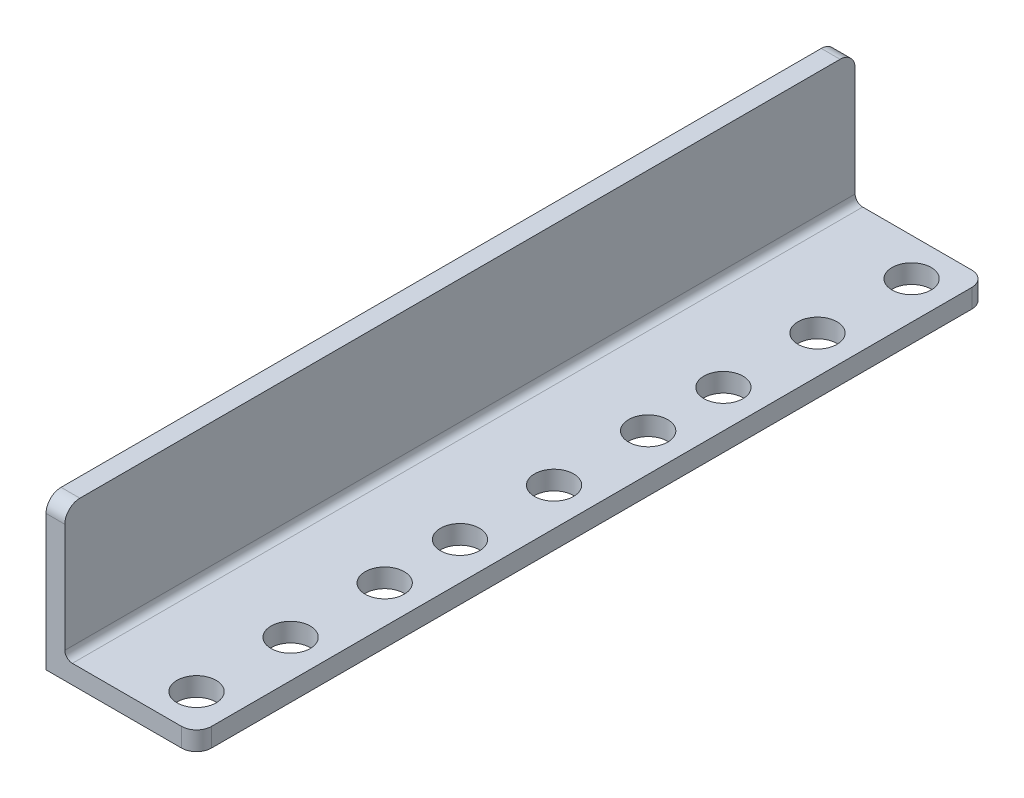
ISO-10303-21;
HEADER;
FILE_DESCRIPTION(('STEP AP214'),'2;1');
FILE_NAME('part.step','',(''),(''),'','','');
FILE_SCHEMA(('AUTOMOTIVE_DESIGN { 1 0 10303 214 1 1 1 1 }'));
ENDSEC;
DATA;
#1=APPLICATION_CONTEXT('core data for automotive mechanical design processes');
#2=APPLICATION_PROTOCOL_DEFINITION('international standard','automotive_design',2000,#1);
#3=PRODUCT_CONTEXT('',#1,'mechanical');
#4=PRODUCT('Part','Part','',(#3));
#5=PRODUCT_RELATED_PRODUCT_CATEGORY('part','',(#4));
#6=PRODUCT_DEFINITION_FORMATION('','',#4);
#7=PRODUCT_DEFINITION_CONTEXT('part definition',#1,'design');
#8=PRODUCT_DEFINITION('design','',#6,#7);
#9=PRODUCT_DEFINITION_SHAPE('','',#8);
#10=(LENGTH_UNIT() NAMED_UNIT(*) SI_UNIT(.MILLI.,.METRE.));
#11=(NAMED_UNIT(*) PLANE_ANGLE_UNIT() SI_UNIT($,.RADIAN.));
#12=(NAMED_UNIT(*) SI_UNIT($,.STERADIAN.) SOLID_ANGLE_UNIT());
#13=UNCERTAINTY_MEASURE_WITH_UNIT(LENGTH_MEASURE(1.E-05),#10,'distance_accuracy_value','');
#14=(GEOMETRIC_REPRESENTATION_CONTEXT(3) GLOBAL_UNCERTAINTY_ASSIGNED_CONTEXT((#13)) GLOBAL_UNIT_ASSIGNED_CONTEXT((#10,
#11,#12)) REPRESENTATION_CONTEXT('',''));
#15=CARTESIAN_POINT('',(0.,0.,0.));
#16=DIRECTION('',(0.,0.,1.));
#17=DIRECTION('',(1.,0.,0.));
#18=AXIS2_PLACEMENT_3D('',#15,#16,#17);
#19=CARTESIAN_POINT('',(19.05,0.,-44.45));
#20=DIRECTION('',(0.,-1.,0.));
#21=DIRECTION('',(0.,0.,-1.));
#22=AXIS2_PLACEMENT_3D('',#19,#20,#21);
#23=CYLINDRICAL_SURFACE('',#22,3.29999999999999);
#24=CARTESIAN_POINT('',(19.05,3.175,-44.45));
#25=DIRECTION('',(0.,-1.,0.));
#26=DIRECTION('',(1.,0.,0.));
#27=AXIS2_PLACEMENT_3D('',#24,#25,#26);
#28=CIRCLE('',#27,3.29999999999999);
#29=CARTESIAN_POINT('',(22.35,3.175,-44.45));
#30=VERTEX_POINT('',#29);
#31=EDGE_CURVE('E190',#30,#30,#28,.T.);
#32=ORIENTED_EDGE('',*,*,#31,.F.);
#33=EDGE_LOOP('',(#32));
#34=FACE_BOUND('',#33,.T.);
#35=CARTESIAN_POINT('',(19.05,0.,-44.45));
#36=DIRECTION('',(0.,-1.,0.));
#37=DIRECTION('',(0.,0.,-1.));
#38=AXIS2_PLACEMENT_3D('',#35,#36,#37);
#39=CIRCLE('',#38,3.29999999999999);
#40=CARTESIAN_POINT('',(19.05,0.,-47.75));
#41=VERTEX_POINT('',#40);
#42=EDGE_CURVE('E193',#41,#41,#39,.T.);
#43=ORIENTED_EDGE('',*,*,#42,.T.);
#44=EDGE_LOOP('',(#43));
#45=FACE_BOUND('',#44,.T.);
#46=ADVANCED_FACE('F35',(#34,#45),#23,.F.);
#47=CARTESIAN_POINT('',(19.05,0.,-60.325));
#48=DIRECTION('',(0.,-1.,0.));
#49=DIRECTION('',(0.,0.,-1.));
#50=AXIS2_PLACEMENT_3D('',#47,#48,#49);
#51=CYLINDRICAL_SURFACE('',#50,3.29999999999999);
#52=CARTESIAN_POINT('',(19.05,3.175,-60.325));
#53=DIRECTION('',(0.,-1.,0.));
#54=DIRECTION('',(1.,0.,0.));
#55=AXIS2_PLACEMENT_3D('',#52,#53,#54);
#56=CIRCLE('',#55,3.29999999999999);
#57=CARTESIAN_POINT('',(22.35,3.175,-60.325));
#58=VERTEX_POINT('',#57);
#59=EDGE_CURVE('E184',#58,#58,#56,.T.);
#60=ORIENTED_EDGE('',*,*,#59,.F.);
#61=EDGE_LOOP('',(#60));
#62=FACE_BOUND('',#61,.T.);
#63=CARTESIAN_POINT('',(19.05,0.,-60.325));
#64=DIRECTION('',(0.,-1.,0.));
#65=DIRECTION('',(0.,0.,-1.));
#66=AXIS2_PLACEMENT_3D('',#63,#64,#65);
#67=CIRCLE('',#66,3.29999999999999);
#68=CARTESIAN_POINT('',(19.05,0.,-63.625));
#69=VERTEX_POINT('',#68);
#70=EDGE_CURVE('E187',#69,#69,#67,.T.);
#71=ORIENTED_EDGE('',*,*,#70,.T.);
#72=EDGE_LOOP('',(#71));
#73=FACE_BOUND('',#72,.T.);
#74=ADVANCED_FACE('F314',(#62,#73),#51,.F.);
#75=CARTESIAN_POINT('',(19.05,0.,-28.575));
#76=DIRECTION('',(0.,-1.,0.));
#77=DIRECTION('',(0.,0.,-1.));
#78=AXIS2_PLACEMENT_3D('',#75,#76,#77);
#79=CYLINDRICAL_SURFACE('',#78,3.29999999999999);
#80=CARTESIAN_POINT('',(19.05,3.175,-28.575));
#81=DIRECTION('',(0.,-1.,0.));
#82=DIRECTION('',(1.,0.,0.));
#83=AXIS2_PLACEMENT_3D('',#80,#81,#82);
#84=CIRCLE('',#83,3.29999999999999);
#85=CARTESIAN_POINT('',(22.35,3.175,-28.575));
#86=VERTEX_POINT('',#85);
#87=EDGE_CURVE('E178',#86,#86,#84,.T.);
#88=ORIENTED_EDGE('',*,*,#87,.F.);
#89=EDGE_LOOP('',(#88));
#90=FACE_BOUND('',#89,.T.);
#91=CARTESIAN_POINT('',(19.05,0.,-28.575));
#92=DIRECTION('',(0.,-1.,0.));
#93=DIRECTION('',(0.,0.,-1.));
#94=AXIS2_PLACEMENT_3D('',#91,#92,#93);
#95=CIRCLE('',#94,3.29999999999999);
#96=CARTESIAN_POINT('',(19.05,0.,-31.875));
#97=VERTEX_POINT('',#96);
#98=EDGE_CURVE('E181',#97,#97,#95,.T.);
#99=ORIENTED_EDGE('',*,*,#98,.T.);
#100=EDGE_LOOP('',(#99));
#101=FACE_BOUND('',#100,.T.);
#102=ADVANCED_FACE('F286',(#90,#101),#79,.F.);
#103=CARTESIAN_POINT('',(25.4,0.,66.675));
#104=DIRECTION('',(0.,1.,0.));
#105=DIRECTION('',(-1.,0.,0.));
#106=AXIS2_PLACEMENT_3D('',#103,#104,#105);
#107=PLANE('',#106);
#108=CARTESIAN_POINT('',(19.05,0.,0.));
#109=DIRECTION('',(0.,-1.,0.));
#110=DIRECTION('',(0.,0.,-1.));
#111=AXIS2_PLACEMENT_3D('',#108,#109,#110);
#112=CIRCLE('',#111,3.29999999999999);
#113=CARTESIAN_POINT('',(19.05,0.,-3.29999999999999));
#114=VERTEX_POINT('',#113);
#115=EDGE_CURVE('E266',#114,#114,#112,.T.);
#116=ORIENTED_EDGE('',*,*,#115,.F.);
#117=EDGE_LOOP('',(#116));
#118=FACE_BOUND('',#117,.T.);
#119=CARTESIAN_POINT('',(19.05,0.,-15.875));
#120=DIRECTION('',(0.,-1.,0.));
#121=DIRECTION('',(0.,0.,-1.));
#122=AXIS2_PLACEMENT_3D('',#119,#120,#121);
#123=CIRCLE('',#122,3.29999999999999);
#124=CARTESIAN_POINT('',(19.05,0.,-19.175));
#125=VERTEX_POINT('',#124);
#126=EDGE_CURVE('E260',#125,#125,#123,.T.);
#127=ORIENTED_EDGE('',*,*,#126,.F.);
#128=EDGE_LOOP('',(#127));
#129=FACE_BOUND('',#128,.T.);
#130=CARTESIAN_POINT('',(19.05,0.,15.875));
#131=DIRECTION('',(0.,-1.,0.));
#132=DIRECTION('',(0.,0.,-1.));
#133=AXIS2_PLACEMENT_3D('',#130,#131,#132);
#134=CIRCLE('',#133,3.29999999999999);
#135=CARTESIAN_POINT('',(19.05,0.,12.575));
#136=VERTEX_POINT('',#135);
#137=EDGE_CURVE('E254',#136,#136,#134,.T.);
#138=ORIENTED_EDGE('',*,*,#137,.F.);
#139=EDGE_LOOP('',(#138));
#140=FACE_BOUND('',#139,.T.);
#141=CARTESIAN_POINT('',(19.05,0.,60.325));
#142=DIRECTION('',(0.,-1.,0.));
#143=DIRECTION('',(0.,0.,-1.));
#144=AXIS2_PLACEMENT_3D('',#141,#142,#143);
#145=CIRCLE('',#144,3.29999999999999);
#146=CARTESIAN_POINT('',(19.05,0.,57.025));
#147=VERTEX_POINT('',#146);
#148=EDGE_CURVE('E251',#147,#147,#145,.T.);
#149=ORIENTED_EDGE('',*,*,#148,.F.);
#150=EDGE_LOOP('',(#149));
#151=FACE_BOUND('',#150,.T.);
#152=CARTESIAN_POINT('',(19.05,0.,44.45));
#153=DIRECTION('',(0.,-1.,0.));
#154=DIRECTION('',(0.,0.,-1.));
#155=AXIS2_PLACEMENT_3D('',#152,#153,#154);
#156=CIRCLE('',#155,3.29999999999999);
#157=CARTESIAN_POINT('',(19.05,0.,41.15));
#158=VERTEX_POINT('',#157);
#159=EDGE_CURVE('E245',#158,#158,#156,.T.);
#160=ORIENTED_EDGE('',*,*,#159,.F.);
#161=EDGE_LOOP('',(#160));
#162=FACE_BOUND('',#161,.T.);
#163=DIRECTION('',(1.,0.,0.));
#164=VECTOR('',#163,1.);
#165=CARTESIAN_POINT('',(25.4,0.,-66.675));
#166=LINE('',#165,#164);
#167=CARTESIAN_POINT('',(0.,0.,-66.675));
#168=VERTEX_POINT('',#167);
#169=CARTESIAN_POINT('',(22.86,0.,-66.675));
#170=VERTEX_POINT('',#169);
#171=EDGE_CURVE('E153',#168,#170,#166,.T.);
#172=ORIENTED_EDGE('',*,*,#171,.T.);
#173=CARTESIAN_POINT('',(22.86,0.,-64.135));
#174=DIRECTION('',(0.,1.,0.));
#175=DIRECTION('',(-1.,0.,0.));
#176=AXIS2_PLACEMENT_3D('',#173,#174,#175);
#177=CIRCLE('',#176,2.54);
#178=CARTESIAN_POINT('',(25.4,0.,-64.135));
#179=VERTEX_POINT('',#178);
#180=EDGE_CURVE('E211',#170,#179,#177,.F.);
#181=ORIENTED_EDGE('',*,*,#180,.T.);
#182=DIRECTION('',(0.,0.,-1.));
#183=VECTOR('',#182,1.);
#184=CARTESIAN_POINT('',(25.4,0.,66.675));
#185=LINE('',#184,#183);
#186=CARTESIAN_POINT('',(25.4,0.,64.135));
#187=VERTEX_POINT('',#186);
#188=EDGE_CURVE('E175',#187,#179,#185,.T.);
#189=ORIENTED_EDGE('',*,*,#188,.F.);
#190=CARTESIAN_POINT('',(22.86,0.,64.135));
#191=DIRECTION('',(0.,1.,0.));
#192=DIRECTION('',(-1.,0.,0.));
#193=AXIS2_PLACEMENT_3D('',#190,#191,#192);
#194=CIRCLE('',#193,2.54);
#195=CARTESIAN_POINT('',(22.86,0.,66.675));
#196=VERTEX_POINT('',#195);
#197=EDGE_CURVE('E209',#187,#196,#194,.F.);
#198=ORIENTED_EDGE('',*,*,#197,.T.);
#199=DIRECTION('',(1.,0.,0.));
#200=VECTOR('',#199,1.);
#201=CARTESIAN_POINT('',(25.4,0.,66.675));
#202=LINE('',#201,#200);
#203=CARTESIAN_POINT('',(0.,0.,66.675));
#204=VERTEX_POINT('',#203);
#205=EDGE_CURVE('E129',#204,#196,#202,.T.);
#206=ORIENTED_EDGE('',*,*,#205,.F.);
#207=DIRECTION('',(0.,0.,-1.));
#208=VECTOR('',#207,1.);
#209=CARTESIAN_POINT('',(0.,0.,66.675));
#210=LINE('',#209,#208);
#211=EDGE_CURVE('E152',#204,#168,#210,.T.);
#212=ORIENTED_EDGE('',*,*,#211,.T.);
#213=EDGE_LOOP('',(#172,#181,#189,#198,#206,#212));
#214=FACE_BOUND('',#213,.T.);
#215=CARTESIAN_POINT('',(19.05,0.,28.575));
#216=DIRECTION('',(0.,-1.,0.));
#217=DIRECTION('',(0.,0.,-1.));
#218=AXIS2_PLACEMENT_3D('',#215,#216,#217);
#219=CIRCLE('',#218,3.29999999999999);
#220=CARTESIAN_POINT('',(19.05,0.,25.275));
#221=VERTEX_POINT('',#220);
#222=EDGE_CURVE('E239',#221,#221,#219,.T.);
#223=ORIENTED_EDGE('',*,*,#222,.F.);
#224=EDGE_LOOP('',(#223));
#225=FACE_BOUND('',#224,.T.);
#226=ORIENTED_EDGE('',*,*,#98,.F.);
#227=EDGE_LOOP('',(#226));
#228=FACE_BOUND('',#227,.T.);
#229=ORIENTED_EDGE('',*,*,#70,.F.);
#230=EDGE_LOOP('',(#229));
#231=FACE_BOUND('',#230,.T.);
#232=ORIENTED_EDGE('',*,*,#42,.F.);
#233=EDGE_LOOP('',(#232));
#234=FACE_BOUND('',#233,.T.);
#235=ADVANCED_FACE('F232',(#118,#129,#140,#151,#162,#214,#225,#228,#231,#234),#107,.F.);
#236=CARTESIAN_POINT('',(25.4,3.175,66.675));
#237=DIRECTION('',(-1.,0.,0.));
#238=DIRECTION('',(0.,0.,1.));
#239=AXIS2_PLACEMENT_3D('',#236,#237,#238);
#240=PLANE('',#239);
#241=ORIENTED_EDGE('',*,*,#188,.T.);
#242=DIRECTION('',(0.,1.,0.));
#243=VECTOR('',#242,1.);
#244=CARTESIAN_POINT('',(25.4,3.175,-64.135));
#245=LINE('',#244,#243);
#246=CARTESIAN_POINT('',(25.4,3.175,-64.135));
#247=VERTEX_POINT('',#246);
#248=EDGE_CURVE('E198',#179,#247,#245,.T.);
#249=ORIENTED_EDGE('',*,*,#248,.T.);
#250=DIRECTION('',(0.,0.,-1.));
#251=VECTOR('',#250,1.);
#252=CARTESIAN_POINT('',(25.4,3.175,66.675));
#253=LINE('',#252,#251);
#254=CARTESIAN_POINT('',(25.4,3.175,64.135));
#255=VERTEX_POINT('',#254);
#256=EDGE_CURVE('E140',#255,#247,#253,.T.);
#257=ORIENTED_EDGE('',*,*,#256,.F.);
#258=DIRECTION('',(0.,1.,0.));
#259=VECTOR('',#258,1.);
#260=CARTESIAN_POINT('',(25.4,3.175,64.135));
#261=LINE('',#260,#259);
#262=EDGE_CURVE('E196',#255,#187,#261,.F.);
#263=ORIENTED_EDGE('',*,*,#262,.T.);
#264=EDGE_LOOP('',(#241,#249,#257,#263));
#265=FACE_BOUND('',#264,.T.);
#266=ADVANCED_FACE('F285',(#265),#240,.F.);
#267=CARTESIAN_POINT('',(4.44500000000001,3.175,66.675));
#268=DIRECTION('',(0.,-1.,0.));
#269=DIRECTION('',(1.,0.,0.));
#270=AXIS2_PLACEMENT_3D('',#267,#268,#269);
#271=PLANE('',#270);
#272=CARTESIAN_POINT('',(19.05,3.175,0.));
#273=DIRECTION('',(0.,-1.,0.));
#274=DIRECTION('',(1.,0.,0.));
#275=AXIS2_PLACEMENT_3D('',#272,#273,#274);
#276=CIRCLE('',#275,3.29999999999999);
#277=CARTESIAN_POINT('',(22.35,3.175,0.));
#278=VERTEX_POINT('',#277);
#279=EDGE_CURVE('E269',#278,#278,#276,.T.);
#280=ORIENTED_EDGE('',*,*,#279,.T.);
#281=EDGE_LOOP('',(#280));
#282=FACE_BOUND('',#281,.T.);
#283=CARTESIAN_POINT('',(19.05,3.175,-15.875));
#284=DIRECTION('',(0.,-1.,0.));
#285=DIRECTION('',(1.,0.,0.));
#286=AXIS2_PLACEMENT_3D('',#283,#284,#285);
#287=CIRCLE('',#286,3.29999999999999);
#288=CARTESIAN_POINT('',(22.35,3.175,-15.875));
#289=VERTEX_POINT('',#288);
#290=EDGE_CURVE('E263',#289,#289,#287,.T.);
#291=ORIENTED_EDGE('',*,*,#290,.T.);
#292=EDGE_LOOP('',(#291));
#293=FACE_BOUND('',#292,.T.);
#294=CARTESIAN_POINT('',(19.05,3.175,15.875));
#295=DIRECTION('',(0.,-1.,0.));
#296=DIRECTION('',(1.,0.,0.));
#297=AXIS2_PLACEMENT_3D('',#294,#295,#296);
#298=CIRCLE('',#297,3.29999999999999);
#299=CARTESIAN_POINT('',(22.35,3.175,15.875));
#300=VERTEX_POINT('',#299);
#301=EDGE_CURVE('E257',#300,#300,#298,.T.);
#302=ORIENTED_EDGE('',*,*,#301,.T.);
#303=EDGE_LOOP('',(#302));
#304=FACE_BOUND('',#303,.T.);
#305=CARTESIAN_POINT('',(19.05,3.175,60.325));
#306=DIRECTION('',(0.,-1.,0.));
#307=DIRECTION('',(1.,0.,0.));
#308=AXIS2_PLACEMENT_3D('',#305,#306,#307);
#309=CIRCLE('',#308,3.29999999999999);
#310=CARTESIAN_POINT('',(22.35,3.175,60.325));
#311=VERTEX_POINT('',#310);
#312=EDGE_CURVE('E248',#311,#311,#309,.T.);
#313=ORIENTED_EDGE('',*,*,#312,.T.);
#314=EDGE_LOOP('',(#313));
#315=FACE_BOUND('',#314,.T.);
#316=CARTESIAN_POINT('',(19.05,3.175,44.45));
#317=DIRECTION('',(0.,-1.,0.));
#318=DIRECTION('',(1.,0.,0.));
#319=AXIS2_PLACEMENT_3D('',#316,#317,#318);
#320=CIRCLE('',#319,3.29999999999999);
#321=CARTESIAN_POINT('',(22.35,3.175,44.45));
#322=VERTEX_POINT('',#321);
#323=EDGE_CURVE('E242',#322,#322,#320,.T.);
#324=ORIENTED_EDGE('',*,*,#323,.T.);
#325=EDGE_LOOP('',(#324));
#326=FACE_BOUND('',#325,.T.);
#327=CARTESIAN_POINT('',(19.05,3.175,28.575));
#328=DIRECTION('',(0.,-1.,0.));
#329=DIRECTION('',(1.,0.,0.));
#330=AXIS2_PLACEMENT_3D('',#327,#328,#329);
#331=CIRCLE('',#330,3.29999999999999);
#332=CARTESIAN_POINT('',(22.35,3.175,28.575));
#333=VERTEX_POINT('',#332);
#334=EDGE_CURVE('E156',#333,#333,#331,.T.);
#335=ORIENTED_EDGE('',*,*,#334,.T.);
#336=EDGE_LOOP('',(#335));
#337=FACE_BOUND('',#336,.T.);
#338=ORIENTED_EDGE('',*,*,#256,.T.);
#339=CARTESIAN_POINT('',(22.86,3.175,-64.135));
#340=DIRECTION('',(0.,-1.,0.));
#341=DIRECTION('',(1.,0.,0.));
#342=AXIS2_PLACEMENT_3D('',#339,#340,#341);
#343=CIRCLE('',#342,2.54);
#344=CARTESIAN_POINT('',(22.86,3.175,-66.675));
#345=VERTEX_POINT('',#344);
#346=EDGE_CURVE('E203',#247,#345,#343,.F.);
#347=ORIENTED_EDGE('',*,*,#346,.T.);
#348=DIRECTION('',(-1.,0.,0.));
#349=VECTOR('',#348,1.);
#350=CARTESIAN_POINT('',(4.44500000000001,3.175,-66.675));
#351=LINE('',#350,#349);
#352=CARTESIAN_POINT('',(4.44500000000001,3.175,-66.675));
#353=VERTEX_POINT('',#352);
#354=EDGE_CURVE('E137',#345,#353,#351,.T.);
#355=ORIENTED_EDGE('',*,*,#354,.T.);
#356=DIRECTION('',(0.,0.,-1.));
#357=VECTOR('',#356,1.);
#358=CARTESIAN_POINT('',(4.44500000000001,3.175,66.675));
#359=LINE('',#358,#357);
#360=CARTESIAN_POINT('',(4.44500000000001,3.175,66.675));
#361=VERTEX_POINT('',#360);
#362=EDGE_CURVE('E132',#361,#353,#359,.T.);
#363=ORIENTED_EDGE('',*,*,#362,.F.);
#364=DIRECTION('',(-1.,0.,0.));
#365=VECTOR('',#364,1.);
#366=CARTESIAN_POINT('',(4.44500000000001,3.175,66.675));
#367=LINE('',#366,#365);
#368=CARTESIAN_POINT('',(22.86,3.175,66.675));
#369=VERTEX_POINT('',#368);
#370=EDGE_CURVE('E120',#369,#361,#367,.T.);
#371=ORIENTED_EDGE('',*,*,#370,.F.);
#372=CARTESIAN_POINT('',(22.86,3.175,64.135));
#373=DIRECTION('',(0.,-1.,0.));
#374=DIRECTION('',(1.,0.,0.));
#375=AXIS2_PLACEMENT_3D('',#372,#373,#374);
#376=CIRCLE('',#375,2.54);
#377=EDGE_CURVE('E201',#369,#255,#376,.F.);
#378=ORIENTED_EDGE('',*,*,#377,.T.);
#379=EDGE_LOOP('',(#338,#347,#355,#363,#371,#378));
#380=FACE_BOUND('',#379,.T.);
#381=ORIENTED_EDGE('',*,*,#87,.T.);
#382=EDGE_LOOP('',(#381));
#383=FACE_BOUND('',#382,.T.);
#384=ORIENTED_EDGE('',*,*,#59,.T.);
#385=EDGE_LOOP('',(#384));
#386=FACE_BOUND('',#385,.T.);
#387=ORIENTED_EDGE('',*,*,#31,.T.);
#388=EDGE_LOOP('',(#387));
#389=FACE_BOUND('',#388,.T.);
#390=ADVANCED_FACE('F134',(#282,#293,#304,#315,#326,#337,#380,#383,#386,#389),#271,.F.);
#391=CARTESIAN_POINT('',(4.445,4.445,66.675));
#392=DIRECTION('',(0.,0.,-1.));
#393=DIRECTION('',(-1.,0.,0.));
#394=AXIS2_PLACEMENT_3D('',#391,#392,#393);
#395=CYLINDRICAL_SURFACE('',#394,1.27);
#396=CARTESIAN_POINT('',(4.445,4.445,-66.675));
#397=DIRECTION('',(0.,0.,-1.));
#398=DIRECTION('',(-1.,0.,0.));
#399=AXIS2_PLACEMENT_3D('',#396,#397,#398);
#400=CIRCLE('',#399,1.27);
#401=CARTESIAN_POINT('',(3.175,4.44500000000001,-66.675));
#402=VERTEX_POINT('',#401);
#403=EDGE_CURVE('E158',#353,#402,#400,.T.);
#404=ORIENTED_EDGE('',*,*,#403,.T.);
#405=DIRECTION('',(0.,0.,-1.));
#406=VECTOR('',#405,1.);
#407=CARTESIAN_POINT('',(3.175,4.44500000000001,66.675));
#408=LINE('',#407,#406);
#409=CARTESIAN_POINT('',(3.175,4.44500000000001,66.675));
#410=VERTEX_POINT('',#409);
#411=EDGE_CURVE('E141',#410,#402,#408,.T.);
#412=ORIENTED_EDGE('',*,*,#411,.F.);
#413=CARTESIAN_POINT('',(4.445,4.445,66.675));
#414=DIRECTION('',(0.,0.,-1.));
#415=DIRECTION('',(-1.,0.,0.));
#416=AXIS2_PLACEMENT_3D('',#413,#414,#415);
#417=CIRCLE('',#416,1.27);
#418=EDGE_CURVE('E125',#361,#410,#417,.T.);
#419=ORIENTED_EDGE('',*,*,#418,.F.);
#420=ORIENTED_EDGE('',*,*,#362,.T.);
#421=EDGE_LOOP('',(#404,#412,#419,#420));
#422=FACE_BOUND('',#421,.T.);
#423=ADVANCED_FACE('F143',(#422),#395,.F.);
#424=CARTESIAN_POINT('',(3.175,25.4,66.675));
#425=DIRECTION('',(-1.,0.,0.));
#426=DIRECTION('',(0.,-1.,0.));
#427=AXIS2_PLACEMENT_3D('',#424,#425,#426);
#428=PLANE('',#427);
#429=DIRECTION('',(0.,1.,0.));
#430=VECTOR('',#429,1.);
#431=CARTESIAN_POINT('',(3.175,25.4,-66.675));
#432=LINE('',#431,#430);
#433=CARTESIAN_POINT('',(3.175,22.86,-66.675));
#434=VERTEX_POINT('',#433);
#435=EDGE_CURVE('E160',#402,#434,#432,.T.);
#436=ORIENTED_EDGE('',*,*,#435,.T.);
#437=CARTESIAN_POINT('',(3.175,22.86,-64.135));
#438=DIRECTION('',(-1.,0.,0.));
#439=DIRECTION('',(0.,-1.,0.));
#440=AXIS2_PLACEMENT_3D('',#437,#438,#439);
#441=CIRCLE('',#440,2.54);
#442=CARTESIAN_POINT('',(3.175,25.4,-64.135));
#443=VERTEX_POINT('',#442);
#444=EDGE_CURVE('E222',#434,#443,#441,.F.);
#445=ORIENTED_EDGE('',*,*,#444,.T.);
#446=DIRECTION('',(0.,0.,-1.));
#447=VECTOR('',#446,1.);
#448=CARTESIAN_POINT('',(3.175,25.4,66.675));
#449=LINE('',#448,#447);
#450=CARTESIAN_POINT('',(3.175,25.4,64.135));
#451=VERTEX_POINT('',#450);
#452=EDGE_CURVE('E170',#451,#443,#449,.T.);
#453=ORIENTED_EDGE('',*,*,#452,.F.);
#454=CARTESIAN_POINT('',(3.175,22.86,64.135));
#455=DIRECTION('',(-1.,0.,0.));
#456=DIRECTION('',(0.,-1.,0.));
#457=AXIS2_PLACEMENT_3D('',#454,#455,#456);
#458=CIRCLE('',#457,2.54);
#459=CARTESIAN_POINT('',(3.175,22.86,66.675));
#460=VERTEX_POINT('',#459);
#461=EDGE_CURVE('E50',#451,#460,#458,.F.);
#462=ORIENTED_EDGE('',*,*,#461,.T.);
#463=DIRECTION('',(0.,1.,0.));
#464=VECTOR('',#463,1.);
#465=CARTESIAN_POINT('',(3.175,25.4,66.675));
#466=LINE('',#465,#464);
#467=EDGE_CURVE('E145',#410,#460,#466,.T.);
#468=ORIENTED_EDGE('',*,*,#467,.F.);
#469=ORIENTED_EDGE('',*,*,#411,.T.);
#470=EDGE_LOOP('',(#436,#445,#453,#462,#468,#469));
#471=FACE_BOUND('',#470,.T.);
#472=ADVANCED_FACE('F346',(#471),#428,.F.);
#473=CARTESIAN_POINT('',(0.,25.4,66.675));
#474=DIRECTION('',(0.,-1.,0.));
#475=DIRECTION('',(0.,0.,-1.));
#476=AXIS2_PLACEMENT_3D('',#473,#474,#475);
#477=PLANE('',#476);
#478=ORIENTED_EDGE('',*,*,#452,.T.);
#479=DIRECTION('',(-1.,0.,0.));
#480=VECTOR('',#479,1.);
#481=CARTESIAN_POINT('',(0.,25.4,-64.135));
#482=LINE('',#481,#480);
#483=CARTESIAN_POINT('',(0.,25.4,-64.135));
#484=VERTEX_POINT('',#483);
#485=EDGE_CURVE('E215',#443,#484,#482,.T.);
#486=ORIENTED_EDGE('',*,*,#485,.T.);
#487=DIRECTION('',(0.,0.,-1.));
#488=VECTOR('',#487,1.);
#489=CARTESIAN_POINT('',(0.,25.4,66.675));
#490=LINE('',#489,#488);
#491=CARTESIAN_POINT('',(0.,25.4,64.135));
#492=VERTEX_POINT('',#491);
#493=EDGE_CURVE('E167',#492,#484,#490,.T.);
#494=ORIENTED_EDGE('',*,*,#493,.F.);
#495=DIRECTION('',(-1.,0.,0.));
#496=VECTOR('',#495,1.);
#497=CARTESIAN_POINT('',(0.,25.4,64.135));
#498=LINE('',#497,#496);
#499=EDGE_CURVE('E213',#492,#451,#498,.F.);
#500=ORIENTED_EDGE('',*,*,#499,.T.);
#501=EDGE_LOOP('',(#478,#486,#494,#500));
#502=FACE_BOUND('',#501,.T.);
#503=ADVANCED_FACE('F351',(#502),#477,.F.);
#504=CARTESIAN_POINT('',(0.,0.,66.675));
#505=DIRECTION('',(1.,0.,0.));
#506=DIRECTION('',(0.,0.,-1.));
#507=AXIS2_PLACEMENT_3D('',#504,#505,#506);
#508=PLANE('',#507);
#509=ORIENTED_EDGE('',*,*,#493,.T.);
#510=CARTESIAN_POINT('',(0.,22.86,-64.135));
#511=DIRECTION('',(1.,0.,0.));
#512=DIRECTION('',(0.,0.,-1.));
#513=AXIS2_PLACEMENT_3D('',#510,#511,#512);
#514=CIRCLE('',#513,2.54);
#515=CARTESIAN_POINT('',(0.,22.86,-66.675));
#516=VERTEX_POINT('',#515);
#517=EDGE_CURVE('E219',#484,#516,#514,.F.);
#518=ORIENTED_EDGE('',*,*,#517,.T.);
#519=DIRECTION('',(0.,-1.,0.));
#520=VECTOR('',#519,1.);
#521=CARTESIAN_POINT('',(0.,0.,-66.675));
#522=LINE('',#521,#520);
#523=EDGE_CURVE('E163',#516,#168,#522,.T.);
#524=ORIENTED_EDGE('',*,*,#523,.T.);
#525=ORIENTED_EDGE('',*,*,#211,.F.);
#526=DIRECTION('',(0.,-1.,0.));
#527=VECTOR('',#526,1.);
#528=CARTESIAN_POINT('',(0.,0.,66.675));
#529=LINE('',#528,#527);
#530=CARTESIAN_POINT('',(0.,22.86,66.675));
#531=VERTEX_POINT('',#530);
#532=EDGE_CURVE('E147',#531,#204,#529,.T.);
#533=ORIENTED_EDGE('',*,*,#532,.F.);
#534=CARTESIAN_POINT('',(0.,22.86,64.135));
#535=DIRECTION('',(1.,0.,0.));
#536=DIRECTION('',(0.,0.,-1.));
#537=AXIS2_PLACEMENT_3D('',#534,#535,#536);
#538=CIRCLE('',#537,2.54);
#539=EDGE_CURVE('E58',#531,#492,#538,.F.);
#540=ORIENTED_EDGE('',*,*,#539,.T.);
#541=EDGE_LOOP('',(#509,#518,#524,#525,#533,#540));
#542=FACE_BOUND('',#541,.T.);
#543=ADVANCED_FACE('F226',(#542),#508,.F.);
#544=CARTESIAN_POINT('',(4.445,4.445,66.675));
#545=DIRECTION('',(0.,0.,-1.));
#546=DIRECTION('',(-1.,0.,0.));
#547=AXIS2_PLACEMENT_3D('',#544,#545,#546);
#548=PLANE('',#547);
#549=ORIENTED_EDGE('',*,*,#205,.T.);
#550=DIRECTION('',(0.,1.,0.));
#551=VECTOR('',#550,1.);
#552=CARTESIAN_POINT('',(22.86,4.445,66.675));
#553=LINE('',#552,#551);
#554=EDGE_CURVE('E11',#196,#369,#553,.T.);
#555=ORIENTED_EDGE('',*,*,#554,.T.);
#556=ORIENTED_EDGE('',*,*,#370,.T.);
#557=ORIENTED_EDGE('',*,*,#418,.T.);
#558=ORIENTED_EDGE('',*,*,#467,.T.);
#559=DIRECTION('',(-1.,0.,0.));
#560=VECTOR('',#559,1.);
#561=CARTESIAN_POINT('',(4.445,22.86,66.675));
#562=LINE('',#561,#560);
#563=EDGE_CURVE('E43',#460,#531,#562,.T.);
#564=ORIENTED_EDGE('',*,*,#563,.T.);
#565=ORIENTED_EDGE('',*,*,#532,.T.);
#566=EDGE_LOOP('',(#549,#555,#556,#557,#558,#564,#565));
#567=FACE_BOUND('',#566,.T.);
#568=ADVANCED_FACE('F123',(#567),#548,.F.);
#569=CARTESIAN_POINT('',(4.445,4.445,-66.675));
#570=DIRECTION('',(0.,0.,-1.));
#571=DIRECTION('',(-1.,0.,0.));
#572=AXIS2_PLACEMENT_3D('',#569,#570,#571);
#573=PLANE('',#572);
#574=ORIENTED_EDGE('',*,*,#354,.F.);
#575=DIRECTION('',(0.,1.,0.));
#576=VECTOR('',#575,1.);
#577=CARTESIAN_POINT('',(22.86,0.,-66.675));
#578=LINE('',#577,#576);
#579=EDGE_CURVE('E207',#345,#170,#578,.F.);
#580=ORIENTED_EDGE('',*,*,#579,.T.);
#581=ORIENTED_EDGE('',*,*,#171,.F.);
#582=ORIENTED_EDGE('',*,*,#523,.F.);
#583=DIRECTION('',(-1.,0.,0.));
#584=VECTOR('',#583,1.);
#585=CARTESIAN_POINT('',(3.175,22.86,-66.675));
#586=LINE('',#585,#584);
#587=EDGE_CURVE('E205',#516,#434,#586,.F.);
#588=ORIENTED_EDGE('',*,*,#587,.T.);
#589=ORIENTED_EDGE('',*,*,#435,.F.);
#590=ORIENTED_EDGE('',*,*,#403,.F.);
#591=EDGE_LOOP('',(#574,#580,#581,#582,#588,#589,#590));
#592=FACE_BOUND('',#591,.T.);
#593=ADVANCED_FACE('F309',(#592),#573,.T.);
#594=CARTESIAN_POINT('',(19.05,0.,28.575));
#595=DIRECTION('',(0.,-1.,0.));
#596=DIRECTION('',(0.,0.,-1.));
#597=AXIS2_PLACEMENT_3D('',#594,#595,#596);
#598=CYLINDRICAL_SURFACE('',#597,3.29999999999999);
#599=ORIENTED_EDGE('',*,*,#334,.F.);
#600=EDGE_LOOP('',(#599));
#601=FACE_BOUND('',#600,.T.);
#602=ORIENTED_EDGE('',*,*,#222,.T.);
#603=EDGE_LOOP('',(#602));
#604=FACE_BOUND('',#603,.T.);
#605=ADVANCED_FACE('F299',(#601,#604),#598,.F.);
#606=CARTESIAN_POINT('',(19.05,0.,44.45));
#607=DIRECTION('',(0.,-1.,0.));
#608=DIRECTION('',(0.,0.,-1.));
#609=AXIS2_PLACEMENT_3D('',#606,#607,#608);
#610=CYLINDRICAL_SURFACE('',#609,3.29999999999999);
#611=ORIENTED_EDGE('',*,*,#323,.F.);
#612=EDGE_LOOP('',(#611));
#613=FACE_BOUND('',#612,.T.);
#614=ORIENTED_EDGE('',*,*,#159,.T.);
#615=EDGE_LOOP('',(#614));
#616=FACE_BOUND('',#615,.T.);
#617=ADVANCED_FACE('F296',(#613,#616),#610,.F.);
#618=CARTESIAN_POINT('',(19.05,0.,60.325));
#619=DIRECTION('',(0.,-1.,0.));
#620=DIRECTION('',(0.,0.,-1.));
#621=AXIS2_PLACEMENT_3D('',#618,#619,#620);
#622=CYLINDRICAL_SURFACE('',#621,3.29999999999999);
#623=ORIENTED_EDGE('',*,*,#312,.F.);
#624=EDGE_LOOP('',(#623));
#625=FACE_BOUND('',#624,.T.);
#626=ORIENTED_EDGE('',*,*,#148,.T.);
#627=EDGE_LOOP('',(#626));
#628=FACE_BOUND('',#627,.T.);
#629=ADVANCED_FACE('F298',(#625,#628),#622,.F.);
#630=CARTESIAN_POINT('',(19.05,0.,15.875));
#631=DIRECTION('',(0.,-1.,0.));
#632=DIRECTION('',(0.,0.,-1.));
#633=AXIS2_PLACEMENT_3D('',#630,#631,#632);
#634=CYLINDRICAL_SURFACE('',#633,3.29999999999999);
#635=ORIENTED_EDGE('',*,*,#301,.F.);
#636=EDGE_LOOP('',(#635));
#637=FACE_BOUND('',#636,.T.);
#638=ORIENTED_EDGE('',*,*,#137,.T.);
#639=EDGE_LOOP('',(#638));
#640=FACE_BOUND('',#639,.T.);
#641=ADVANCED_FACE('F306',(#637,#640),#634,.F.);
#642=CARTESIAN_POINT('',(19.05,0.,-15.875));
#643=DIRECTION('',(0.,-1.,0.));
#644=DIRECTION('',(0.,0.,-1.));
#645=AXIS2_PLACEMENT_3D('',#642,#643,#644);
#646=CYLINDRICAL_SURFACE('',#645,3.29999999999999);
#647=ORIENTED_EDGE('',*,*,#290,.F.);
#648=EDGE_LOOP('',(#647));
#649=FACE_BOUND('',#648,.T.);
#650=ORIENTED_EDGE('',*,*,#126,.T.);
#651=EDGE_LOOP('',(#650));
#652=FACE_BOUND('',#651,.T.);
#653=ADVANCED_FACE('F279',(#649,#652),#646,.F.);
#654=CARTESIAN_POINT('',(19.05,0.,0.));
#655=DIRECTION('',(0.,-1.,0.));
#656=DIRECTION('',(0.,0.,-1.));
#657=AXIS2_PLACEMENT_3D('',#654,#655,#656);
#658=CYLINDRICAL_SURFACE('',#657,3.29999999999999);
#659=ORIENTED_EDGE('',*,*,#279,.F.);
#660=EDGE_LOOP('',(#659));
#661=FACE_BOUND('',#660,.T.);
#662=ORIENTED_EDGE('',*,*,#115,.T.);
#663=EDGE_LOOP('',(#662));
#664=FACE_BOUND('',#663,.T.);
#665=ADVANCED_FACE('F275',(#661,#664),#658,.F.);
#666=CARTESIAN_POINT('',(22.86,3.175,-64.135));
#667=DIRECTION('',(0.,-1.,0.));
#668=DIRECTION('',(0.,0.,-1.));
#669=AXIS2_PLACEMENT_3D('',#666,#667,#668);
#670=CYLINDRICAL_SURFACE('',#669,2.54);
#671=ORIENTED_EDGE('',*,*,#180,.F.);
#672=ORIENTED_EDGE('',*,*,#579,.F.);
#673=ORIENTED_EDGE('',*,*,#346,.F.);
#674=ORIENTED_EDGE('',*,*,#248,.F.);
#675=EDGE_LOOP('',(#671,#672,#673,#674));
#676=FACE_BOUND('',#675,.T.);
#677=ADVANCED_FACE('F278',(#676),#670,.T.);
#678=CARTESIAN_POINT('',(0.,22.86,-64.135));
#679=DIRECTION('',(1.,0.,0.));
#680=DIRECTION('',(0.,0.,-1.));
#681=AXIS2_PLACEMENT_3D('',#678,#679,#680);
#682=CYLINDRICAL_SURFACE('',#681,2.54);
#683=ORIENTED_EDGE('',*,*,#444,.F.);
#684=ORIENTED_EDGE('',*,*,#587,.F.);
#685=ORIENTED_EDGE('',*,*,#517,.F.);
#686=ORIENTED_EDGE('',*,*,#485,.F.);
#687=EDGE_LOOP('',(#683,#684,#685,#686));
#688=FACE_BOUND('',#687,.T.);
#689=ADVANCED_FACE('F328',(#688),#682,.T.);
#690=CARTESIAN_POINT('',(22.86,4.445,64.135));
#691=DIRECTION('',(0.,1.,0.));
#692=DIRECTION('',(0.,0.,1.));
#693=AXIS2_PLACEMENT_3D('',#690,#691,#692);
#694=CYLINDRICAL_SURFACE('',#693,2.54);
#695=ORIENTED_EDGE('',*,*,#197,.F.);
#696=ORIENTED_EDGE('',*,*,#262,.F.);
#697=ORIENTED_EDGE('',*,*,#377,.F.);
#698=ORIENTED_EDGE('',*,*,#554,.F.);
#699=EDGE_LOOP('',(#695,#696,#697,#698));
#700=FACE_BOUND('',#699,.T.);
#701=ADVANCED_FACE('F331',(#700),#694,.T.);
#702=CARTESIAN_POINT('',(4.445,22.86,64.135));
#703=DIRECTION('',(-1.,0.,0.));
#704=DIRECTION('',(0.,0.,1.));
#705=AXIS2_PLACEMENT_3D('',#702,#703,#704);
#706=CYLINDRICAL_SURFACE('',#705,2.54);
#707=ORIENTED_EDGE('',*,*,#461,.F.);
#708=ORIENTED_EDGE('',*,*,#499,.F.);
#709=ORIENTED_EDGE('',*,*,#539,.F.);
#710=ORIENTED_EDGE('',*,*,#563,.F.);
#711=EDGE_LOOP('',(#707,#708,#709,#710));
#712=FACE_BOUND('',#711,.T.);
#713=ADVANCED_FACE('F37',(#712),#706,.T.);
#714=CLOSED_SHELL('',(#46,#74,#102,#235,#266,#390,#423,#472,#503,#543,#568,#593,#605,#617,#629,
#641,#653,#665,#677,#689,#701,#713));
#715=MANIFOLD_SOLID_BREP('B2',#714);
#716=ADVANCED_BREP_SHAPE_REPRESENTATION('',(#18,#715),#14);
#717=SHAPE_DEFINITION_REPRESENTATION(#9,#716);
ENDSEC;
END-ISO-10303-21;
